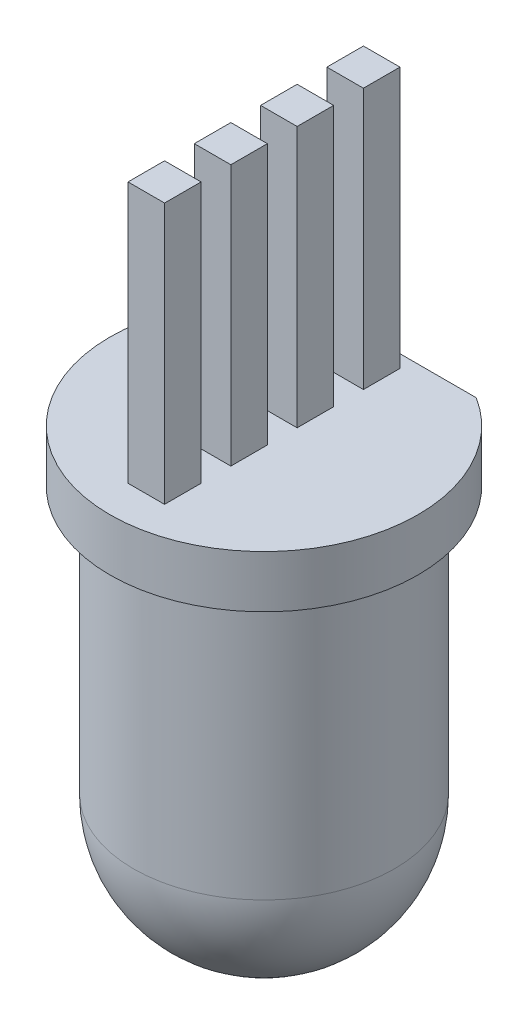
ISO-10303-21;
HEADER;
FILE_DESCRIPTION(('STEP AP214'),'2;1');
FILE_NAME('part.step','',(''),(''),'','','');
FILE_SCHEMA(('AUTOMOTIVE_DESIGN { 1 0 10303 214 1 1 1 1 }'));
ENDSEC;
DATA;
#1=APPLICATION_CONTEXT('core data for automotive mechanical design processes');
#2=APPLICATION_PROTOCOL_DEFINITION('international standard','automotive_design',2000,#1);
#3=PRODUCT_CONTEXT('',#1,'mechanical');
#4=PRODUCT('Part','Part','',(#3));
#5=PRODUCT_RELATED_PRODUCT_CATEGORY('part','',(#4));
#6=PRODUCT_DEFINITION_FORMATION('','',#4);
#7=PRODUCT_DEFINITION_CONTEXT('part definition',#1,'design');
#8=PRODUCT_DEFINITION('design','',#6,#7);
#9=PRODUCT_DEFINITION_SHAPE('','',#8);
#10=(LENGTH_UNIT() NAMED_UNIT(*) SI_UNIT(.MILLI.,.METRE.));
#11=(NAMED_UNIT(*) PLANE_ANGLE_UNIT() SI_UNIT($,.RADIAN.));
#12=(NAMED_UNIT(*) SI_UNIT($,.STERADIAN.) SOLID_ANGLE_UNIT());
#13=UNCERTAINTY_MEASURE_WITH_UNIT(LENGTH_MEASURE(1.E-05),#10,'distance_accuracy_value','');
#14=(GEOMETRIC_REPRESENTATION_CONTEXT(3) GLOBAL_UNCERTAINTY_ASSIGNED_CONTEXT((#13)) GLOBAL_UNIT_ASSIGNED_CONTEXT((#10,
#11,#12)) REPRESENTATION_CONTEXT('',''));
#15=CARTESIAN_POINT('',(0.,0.,0.));
#16=DIRECTION('',(0.,0.,1.));
#17=DIRECTION('',(1.,0.,0.));
#18=AXIS2_PLACEMENT_3D('',#15,#16,#17);
#19=CARTESIAN_POINT('',(2.95000000000001,8.6,0.));
#20=DIRECTION('',(0.,1.,0.));
#21=DIRECTION('',(-1.,0.,0.));
#22=AXIS2_PLACEMENT_3D('',#19,#20,#21);
#23=PLANE('',#22);
#24=DIRECTION('',(1.,0.,0.));
#25=VECTOR('',#24,1.);
#26=CARTESIAN_POINT('',(0.350000000000002,8.6,2.255));
#27=LINE('',#26,#25);
#28=CARTESIAN_POINT('',(-0.349999999999998,8.6,2.255));
#29=VERTEX_POINT('',#28);
#30=CARTESIAN_POINT('',(0.350000000000002,8.6,2.255));
#31=VERTEX_POINT('',#30);
#32=EDGE_CURVE('E382',#29,#31,#27,.T.);
#33=ORIENTED_EDGE('',*,*,#32,.F.);
#34=DIRECTION('',(0.,0.,1.));
#35=VECTOR('',#34,1.);
#36=CARTESIAN_POINT('',(-0.349999999999998,8.6,2.255));
#37=LINE('',#36,#35);
#38=CARTESIAN_POINT('',(-0.349999999999998,8.6,1.555));
#39=VERTEX_POINT('',#38);
#40=EDGE_CURVE('E378',#39,#29,#37,.T.);
#41=ORIENTED_EDGE('',*,*,#40,.F.);
#42=DIRECTION('',(-1.,0.,0.));
#43=VECTOR('',#42,1.);
#44=CARTESIAN_POINT('',(-0.349999999999998,8.6,1.555));
#45=LINE('',#44,#43);
#46=CARTESIAN_POINT('',(0.350000000000017,8.6,1.555));
#47=VERTEX_POINT('',#46);
#48=EDGE_CURVE('E390',#47,#39,#45,.T.);
#49=ORIENTED_EDGE('',*,*,#48,.F.);
#50=DIRECTION('',(0.,0.,-1.));
#51=VECTOR('',#50,1.);
#52=CARTESIAN_POINT('',(0.350000000000002,8.6,1.555));
#53=LINE('',#52,#51);
#54=EDGE_CURVE('E386',#31,#47,#53,.T.);
#55=ORIENTED_EDGE('',*,*,#54,.F.);
#56=EDGE_LOOP('',(#33,#41,#49,#55));
#57=FACE_BOUND('',#56,.T.);
#58=DIRECTION('',(1.,0.,0.));
#59=VECTOR('',#58,1.);
#60=CARTESIAN_POINT('',(0.350000000000002,8.6,-1.555));
#61=LINE('',#60,#59);
#62=CARTESIAN_POINT('',(-0.349999999999998,8.6,-1.555));
#63=VERTEX_POINT('',#62);
#64=CARTESIAN_POINT('',(0.350000000000002,8.6,-1.555));
#65=VERTEX_POINT('',#64);
#66=EDGE_CURVE('E437',#63,#65,#61,.T.);
#67=ORIENTED_EDGE('',*,*,#66,.F.);
#68=DIRECTION('',(0.,0.,1.));
#69=VECTOR('',#68,1.);
#70=CARTESIAN_POINT('',(-0.349999999999998,8.6,-1.555));
#71=LINE('',#70,#69);
#72=CARTESIAN_POINT('',(-0.349999999999998,8.6,-2.255));
#73=VERTEX_POINT('',#72);
#74=EDGE_CURVE('E434',#73,#63,#71,.T.);
#75=ORIENTED_EDGE('',*,*,#74,.F.);
#76=DIRECTION('',(-1.,0.,0.));
#77=VECTOR('',#76,1.);
#78=CARTESIAN_POINT('',(-0.349999999999998,8.6,-2.255));
#79=LINE('',#78,#77);
#80=CARTESIAN_POINT('',(0.350000000000016,8.6,-2.255));
#81=VERTEX_POINT('',#80);
#82=EDGE_CURVE('E192',#81,#73,#79,.T.);
#83=ORIENTED_EDGE('',*,*,#82,.F.);
#84=DIRECTION('',(0.,0.,-1.));
#85=VECTOR('',#84,1.);
#86=CARTESIAN_POINT('',(0.350000000000002,8.6,-2.255));
#87=LINE('',#86,#85);
#88=EDGE_CURVE('E201',#65,#81,#87,.T.);
#89=ORIENTED_EDGE('',*,*,#88,.F.);
#90=EDGE_LOOP('',(#67,#75,#83,#89));
#91=FACE_BOUND('',#90,.T.);
#92=DIRECTION('',(-1.,0.,0.));
#93=VECTOR('',#92,1.);
#94=CARTESIAN_POINT('',(-2.03164321843019,8.6,-2.5));
#95=LINE('',#94,#93);
#96=CARTESIAN_POINT('',(1.56604597633659,8.6,-2.5));
#97=VERTEX_POINT('',#96);
#98=CARTESIAN_POINT('',(-1.56604597633658,8.6,-2.5));
#99=VERTEX_POINT('',#98);
#100=EDGE_CURVE('E221',#97,#99,#95,.T.);
#101=ORIENTED_EDGE('',*,*,#100,.T.);
#102=CARTESIAN_POINT('',(0.,8.6,0.));
#103=DIRECTION('',(0.,-1.,0.));
#104=DIRECTION('',(1.,0.,0.));
#105=AXIS2_PLACEMENT_3D('',#102,#103,#104);
#106=CIRCLE('',#105,2.95);
#107=EDGE_CURVE('E51',#97,#99,#106,.T.);
#108=ORIENTED_EDGE('',*,*,#107,.F.);
#109=EDGE_LOOP('',(#101,#108));
#110=FACE_BOUND('',#109,.T.);
#111=DIRECTION('',(1.,0.,0.));
#112=VECTOR('',#111,1.);
#113=CARTESIAN_POINT('',(-0.349999999999994,8.6,0.985));
#114=LINE('',#113,#112);
#115=CARTESIAN_POINT('',(-0.349999999999994,8.6,0.985));
#116=VERTEX_POINT('',#115);
#117=CARTESIAN_POINT('',(0.350000000000005,8.6,0.985));
#118=VERTEX_POINT('',#117);
#119=EDGE_CURVE('E410',#116,#118,#114,.T.);
#120=ORIENTED_EDGE('',*,*,#119,.F.);
#121=DIRECTION('',(0.,0.,1.));
#122=VECTOR('',#121,1.);
#123=CARTESIAN_POINT('',(-0.349999999999995,8.6,0.285000000000001));
#124=LINE('',#123,#122);
#125=CARTESIAN_POINT('',(-0.349999999999995,8.6,0.285000000000001));
#126=VERTEX_POINT('',#125);
#127=EDGE_CURVE('E406',#126,#116,#124,.T.);
#128=ORIENTED_EDGE('',*,*,#127,.F.);
#129=DIRECTION('',(-1.,0.,0.));
#130=VECTOR('',#129,1.);
#131=CARTESIAN_POINT('',(0.350000000000005,8.6,0.285000000000001));
#132=LINE('',#131,#130);
#133=CARTESIAN_POINT('',(0.35000000000002,8.6,0.285000000000001));
#134=VERTEX_POINT('',#133);
#135=EDGE_CURVE('E418',#134,#126,#132,.T.);
#136=ORIENTED_EDGE('',*,*,#135,.F.);
#137=DIRECTION('',(0.,0.,-1.));
#138=VECTOR('',#137,1.);
#139=CARTESIAN_POINT('',(0.350000000000005,8.6,0.985));
#140=LINE('',#139,#138);
#141=EDGE_CURVE('E414',#118,#134,#140,.T.);
#142=ORIENTED_EDGE('',*,*,#141,.F.);
#143=EDGE_LOOP('',(#120,#128,#136,#142));
#144=FACE_BOUND('',#143,.T.);
#145=DIRECTION('',(1.,0.,0.));
#146=VECTOR('',#145,1.);
#147=CARTESIAN_POINT('',(0.350000000000003,8.6,-0.285000000000001));
#148=LINE('',#147,#146);
#149=CARTESIAN_POINT('',(-0.349999999999998,8.6,-0.285));
#150=VERTEX_POINT('',#149);
#151=CARTESIAN_POINT('',(0.350000000000003,8.6,-0.285000000000001));
#152=VERTEX_POINT('',#151);
#153=EDGE_CURVE('E452',#150,#152,#148,.T.);
#154=ORIENTED_EDGE('',*,*,#153,.F.);
#155=DIRECTION('',(0.,0.,1.));
#156=VECTOR('',#155,1.);
#157=CARTESIAN_POINT('',(-0.349999999999998,8.6,-0.285));
#158=LINE('',#157,#156);
#159=CARTESIAN_POINT('',(-0.349999999999998,8.6,-0.985));
#160=VERTEX_POINT('',#159);
#161=EDGE_CURVE('E447',#160,#150,#158,.T.);
#162=ORIENTED_EDGE('',*,*,#161,.F.);
#163=DIRECTION('',(-1.,0.,0.));
#164=VECTOR('',#163,1.);
#165=CARTESIAN_POINT('',(-0.349999999999998,8.6,-0.985));
#166=LINE('',#165,#164);
#167=CARTESIAN_POINT('',(0.350000000000017,8.6,-0.985));
#168=VERTEX_POINT('',#167);
#169=EDGE_CURVE('E372',#168,#160,#166,.T.);
#170=ORIENTED_EDGE('',*,*,#169,.F.);
#171=DIRECTION('',(0.,0.,-1.));
#172=VECTOR('',#171,1.);
#173=CARTESIAN_POINT('',(0.350000000000002,8.6,-0.985));
#174=LINE('',#173,#172);
#175=EDGE_CURVE('E363',#152,#168,#174,.T.);
#176=ORIENTED_EDGE('',*,*,#175,.F.);
#177=EDGE_LOOP('',(#154,#162,#170,#176));
#178=FACE_BOUND('',#177,.T.);
#179=ADVANCED_FACE('F42',(#57,#91,#110,#144,#178),#23,.T.);
#180=CARTESIAN_POINT('',(0.,2.5,0.));
#181=DIRECTION('',(0.,-1.,0.));
#182=DIRECTION('',(-1.,0.,0.));
#183=AXIS2_PLACEMENT_3D('',#180,#181,#182);
#184=SPHERICAL_SURFACE('',#183,2.5);
#185=CARTESIAN_POINT('',(0.,2.5,0.));
#186=DIRECTION('',(0.,-1.,0.));
#187=DIRECTION('',(1.,0.,0.));
#188=AXIS2_PLACEMENT_3D('',#185,#186,#187);
#189=CIRCLE('',#188,2.50000000000001);
#190=CARTESIAN_POINT('',(2.50000000000001,2.5,0.));
#191=VERTEX_POINT('',#190);
#192=EDGE_CURVE('E225',#191,#191,#189,.T.);
#193=ORIENTED_EDGE('',*,*,#192,.T.);
#194=EDGE_LOOP('',(#193));
#195=FACE_BOUND('',#194,.T.);
#196=ADVANCED_FACE('F44',(#195),#184,.T.);
#197=CARTESIAN_POINT('',(0.,0.,0.));
#198=DIRECTION('',(0.,-1.,0.));
#199=DIRECTION('',(1.,0.,0.));
#200=AXIS2_PLACEMENT_3D('',#197,#198,#199);
#201=CYLINDRICAL_SURFACE('',#200,2.95);
#202=DIRECTION('',(0.,-1.,0.));
#203=VECTOR('',#202,1.);
#204=CARTESIAN_POINT('',(-1.56604597633658,0.,-2.5));
#205=LINE('',#204,#203);
#206=CARTESIAN_POINT('',(-1.56604597633658,7.6,-2.5));
#207=VERTEX_POINT('',#206);
#208=EDGE_CURVE('E213',#99,#207,#205,.T.);
#209=ORIENTED_EDGE('',*,*,#208,.T.);
#210=CARTESIAN_POINT('',(0.,7.6,0.));
#211=DIRECTION('',(0.,-1.,0.));
#212=DIRECTION('',(1.,0.,0.));
#213=AXIS2_PLACEMENT_3D('',#210,#211,#212);
#214=CIRCLE('',#213,2.95);
#215=CARTESIAN_POINT('',(1.56604597633659,7.6,-2.5));
#216=VERTEX_POINT('',#215);
#217=EDGE_CURVE('E233',#216,#207,#214,.T.);
#218=ORIENTED_EDGE('',*,*,#217,.F.);
#219=DIRECTION('',(0.,-1.,0.));
#220=VECTOR('',#219,1.);
#221=CARTESIAN_POINT('',(1.56604597633658,0.,-2.5));
#222=LINE('',#221,#220);
#223=EDGE_CURVE('E209',#216,#97,#222,.F.);
#224=ORIENTED_EDGE('',*,*,#223,.T.);
#225=ORIENTED_EDGE('',*,*,#107,.T.);
#226=EDGE_LOOP('',(#209,#218,#224,#225));
#227=FACE_BOUND('',#226,.T.);
#228=ADVANCED_FACE('F240',(#227),#201,.T.);
#229=CARTESIAN_POINT('',(2.50000000000001,7.6,0.));
#230=DIRECTION('',(0.,-1.,0.));
#231=DIRECTION('',(1.,0.,0.));
#232=AXIS2_PLACEMENT_3D('',#229,#230,#231);
#233=PLANE('',#232);
#234=DIRECTION('',(-1.,0.,0.));
#235=VECTOR('',#234,1.);
#236=CARTESIAN_POINT('',(-2.03164321843019,7.6,-2.5));
#237=LINE('',#236,#235);
#238=CARTESIAN_POINT('',(0.,7.6,-2.5));
#239=VERTEX_POINT('',#238);
#240=EDGE_CURVE('E218',#216,#239,#237,.T.);
#241=ORIENTED_EDGE('',*,*,#240,.F.);
#242=ORIENTED_EDGE('',*,*,#217,.T.);
#243=EDGE_CURVE('E217',#239,#207,#237,.T.);
#244=ORIENTED_EDGE('',*,*,#243,.F.);
#245=CARTESIAN_POINT('',(0.,7.6,0.));
#246=DIRECTION('',(0.,-1.,0.));
#247=DIRECTION('',(1.,0.,0.));
#248=AXIS2_PLACEMENT_3D('',#245,#246,#247);
#249=CIRCLE('',#248,2.5);
#250=EDGE_CURVE('E229',#239,#239,#249,.T.);
#251=ORIENTED_EDGE('',*,*,#250,.F.);
#252=EDGE_LOOP('',(#241,#242,#244,#251));
#253=FACE_BOUND('',#252,.T.);
#254=ADVANCED_FACE('F251',(#253),#233,.T.);
#255=CARTESIAN_POINT('',(0.,0.,0.));
#256=DIRECTION('',(0.,-1.,0.));
#257=DIRECTION('',(1.,0.,0.));
#258=AXIS2_PLACEMENT_3D('',#255,#256,#257);
#259=CYLINDRICAL_SURFACE('',#258,2.5);
#260=ORIENTED_EDGE('',*,*,#250,.T.);
#261=EDGE_LOOP('',(#260));
#262=FACE_BOUND('',#261,.T.);
#263=ORIENTED_EDGE('',*,*,#192,.F.);
#264=EDGE_LOOP('',(#263));
#265=FACE_BOUND('',#264,.T.);
#266=ADVANCED_FACE('F253',(#262,#265),#259,.T.);
#267=CARTESIAN_POINT('',(-2.03164321843019,8.601,-2.5));
#268=DIRECTION('',(0.,0.,1.));
#269=DIRECTION('',(1.,0.,0.));
#270=AXIS2_PLACEMENT_3D('',#267,#268,#269);
#271=PLANE('',#270);
#272=ORIENTED_EDGE('',*,*,#100,.F.);
#273=ORIENTED_EDGE('',*,*,#223,.F.);
#274=ORIENTED_EDGE('',*,*,#240,.T.);
#275=ORIENTED_EDGE('',*,*,#243,.T.);
#276=ORIENTED_EDGE('',*,*,#208,.F.);
#277=EDGE_LOOP('',(#272,#273,#274,#275,#276));
#278=FACE_BOUND('',#277,.T.);
#279=ADVANCED_FACE('F245',(#278),#271,.F.);
#280=CARTESIAN_POINT('',(-0.349999999999984,33.1,-1.555));
#281=DIRECTION('',(1.,0.,0.));
#282=DIRECTION('',(0.,1.,0.));
#283=AXIS2_PLACEMENT_3D('',#280,#281,#282);
#284=PLANE('',#283);
#285=DIRECTION('',(0.,-1.,0.));
#286=VECTOR('',#285,1.);
#287=CARTESIAN_POINT('',(-0.349999999999984,33.1,-1.555));
#288=LINE('',#287,#286);
#289=CARTESIAN_POINT('',(-0.349999999999995,13.6,-1.555));
#290=VERTEX_POINT('',#289);
#291=EDGE_CURVE('E185',#290,#63,#288,.T.);
#292=ORIENTED_EDGE('',*,*,#291,.F.);
#293=DIRECTION('',(0.,0.,1.));
#294=VECTOR('',#293,1.);
#295=CARTESIAN_POINT('',(-0.349999999999995,13.6,2.255));
#296=LINE('',#295,#294);
#297=CARTESIAN_POINT('',(-0.349999999999995,13.6,-2.255));
#298=VERTEX_POINT('',#297);
#299=EDGE_CURVE('E171',#298,#290,#296,.T.);
#300=ORIENTED_EDGE('',*,*,#299,.F.);
#301=DIRECTION('',(0.,-1.,0.));
#302=VECTOR('',#301,1.);
#303=CARTESIAN_POINT('',(-0.349999999999984,33.1,-2.255));
#304=LINE('',#303,#302);
#305=EDGE_CURVE('E183',#298,#73,#304,.T.);
#306=ORIENTED_EDGE('',*,*,#305,.T.);
#307=ORIENTED_EDGE('',*,*,#74,.T.);
#308=EDGE_LOOP('',(#292,#300,#306,#307));
#309=FACE_BOUND('',#308,.T.);
#310=ADVANCED_FACE('F181',(#309),#284,.F.);
#311=CARTESIAN_POINT('',(0.350000000000016,33.1,-1.555));
#312=DIRECTION('',(0.,0.,-1.));
#313=DIRECTION('',(-1.,0.,0.));
#314=AXIS2_PLACEMENT_3D('',#311,#312,#313);
#315=PLANE('',#314);
#316=DIRECTION('',(0.,-1.,0.));
#317=VECTOR('',#316,1.);
#318=CARTESIAN_POINT('',(0.350000000000016,33.1,-1.555));
#319=LINE('',#318,#317);
#320=CARTESIAN_POINT('',(0.350000000000005,13.6,-1.555));
#321=VERTEX_POINT('',#320);
#322=EDGE_CURVE('E199',#321,#65,#319,.T.);
#323=ORIENTED_EDGE('',*,*,#322,.F.);
#324=DIRECTION('',(-1.,0.,0.));
#325=VECTOR('',#324,1.);
#326=CARTESIAN_POINT('',(0.350000000000005,13.6,-1.555));
#327=LINE('',#326,#325);
#328=EDGE_CURVE('E445',#321,#290,#327,.T.);
#329=ORIENTED_EDGE('',*,*,#328,.T.);
#330=ORIENTED_EDGE('',*,*,#291,.T.);
#331=ORIENTED_EDGE('',*,*,#66,.T.);
#332=EDGE_LOOP('',(#323,#329,#330,#331));
#333=FACE_BOUND('',#332,.T.);
#334=ADVANCED_FACE('F277',(#333),#315,.F.);
#335=CARTESIAN_POINT('',(0.350000000000016,33.1,-2.255));
#336=DIRECTION('',(-1.,0.,0.));
#337=DIRECTION('',(0.,-1.,0.));
#338=AXIS2_PLACEMENT_3D('',#335,#336,#337);
#339=PLANE('',#338);
#340=DIRECTION('',(0.,-1.,0.));
#341=VECTOR('',#340,1.);
#342=CARTESIAN_POINT('',(0.350000000000016,33.1,-2.255));
#343=LINE('',#342,#341);
#344=CARTESIAN_POINT('',(0.350000000000005,13.6,-2.255));
#345=VERTEX_POINT('',#344);
#346=EDGE_CURVE('E195',#345,#81,#343,.T.);
#347=ORIENTED_EDGE('',*,*,#346,.F.);
#348=DIRECTION('',(0.,0.,1.));
#349=VECTOR('',#348,1.);
#350=CARTESIAN_POINT('',(0.350000000000005,13.6,-2.255));
#351=LINE('',#350,#349);
#352=EDGE_CURVE('E58',#345,#321,#351,.T.);
#353=ORIENTED_EDGE('',*,*,#352,.T.);
#354=ORIENTED_EDGE('',*,*,#322,.T.);
#355=ORIENTED_EDGE('',*,*,#88,.T.);
#356=EDGE_LOOP('',(#347,#353,#354,#355));
#357=FACE_BOUND('',#356,.T.);
#358=ADVANCED_FACE('F280',(#357),#339,.F.);
#359=CARTESIAN_POINT('',(-0.349999999999984,33.1,-2.255));
#360=DIRECTION('',(0.,0.,1.));
#361=DIRECTION('',(1.,0.,0.));
#362=AXIS2_PLACEMENT_3D('',#359,#360,#361);
#363=PLANE('',#362);
#364=ORIENTED_EDGE('',*,*,#305,.F.);
#365=DIRECTION('',(-1.,0.,0.));
#366=VECTOR('',#365,1.);
#367=CARTESIAN_POINT('',(2.95000000000002,13.6,-2.255));
#368=LINE('',#367,#366);
#369=EDGE_CURVE('E168',#345,#298,#368,.T.);
#370=ORIENTED_EDGE('',*,*,#369,.F.);
#371=ORIENTED_EDGE('',*,*,#346,.T.);
#372=ORIENTED_EDGE('',*,*,#82,.T.);
#373=EDGE_LOOP('',(#364,#370,#371,#372));
#374=FACE_BOUND('',#373,.T.);
#375=ADVANCED_FACE('F190',(#374),#363,.F.);
#376=CARTESIAN_POINT('',(-0.34999999999998,33.1,0.285000000000001));
#377=DIRECTION('',(1.,0.,0.));
#378=DIRECTION('',(0.,1.,0.));
#379=AXIS2_PLACEMENT_3D('',#376,#377,#378);
#380=PLANE('',#379);
#381=DIRECTION('',(0.,-1.,0.));
#382=VECTOR('',#381,1.);
#383=CARTESIAN_POINT('',(-0.34999999999998,33.1,0.985));
#384=LINE('',#383,#382);
#385=CARTESIAN_POINT('',(-0.349999999999995,13.6,0.985));
#386=VERTEX_POINT('',#385);
#387=EDGE_CURVE('E431',#386,#116,#384,.T.);
#388=ORIENTED_EDGE('',*,*,#387,.F.);
#389=CARTESIAN_POINT('',(-0.349999999999995,13.6,0.285000000000001));
#390=VERTEX_POINT('',#389);
#391=EDGE_CURVE('E468',#390,#386,#296,.T.);
#392=ORIENTED_EDGE('',*,*,#391,.F.);
#393=DIRECTION('',(0.,-1.,0.));
#394=VECTOR('',#393,1.);
#395=CARTESIAN_POINT('',(-0.34999999999998,33.1,0.285000000000001));
#396=LINE('',#395,#394);
#397=EDGE_CURVE('E422',#390,#126,#396,.T.);
#398=ORIENTED_EDGE('',*,*,#397,.T.);
#399=ORIENTED_EDGE('',*,*,#127,.T.);
#400=EDGE_LOOP('',(#388,#392,#398,#399));
#401=FACE_BOUND('',#400,.T.);
#402=ADVANCED_FACE('F287',(#401),#380,.F.);
#403=CARTESIAN_POINT('',(-0.34999999999998,33.1,0.985));
#404=DIRECTION('',(0.,0.,-1.));
#405=DIRECTION('',(-1.,0.,0.));
#406=AXIS2_PLACEMENT_3D('',#403,#404,#405);
#407=PLANE('',#406);
#408=DIRECTION('',(0.,-1.,0.));
#409=VECTOR('',#408,1.);
#410=CARTESIAN_POINT('',(0.35000000000002,33.1,0.985));
#411=LINE('',#410,#409);
#412=CARTESIAN_POINT('',(0.350000000000008,13.6,0.985));
#413=VERTEX_POINT('',#412);
#414=EDGE_CURVE('E428',#413,#118,#411,.T.);
#415=ORIENTED_EDGE('',*,*,#414,.F.);
#416=DIRECTION('',(-1.,0.,0.));
#417=VECTOR('',#416,1.);
#418=CARTESIAN_POINT('',(-0.349999999999991,13.6,0.985));
#419=LINE('',#418,#417);
#420=EDGE_CURVE('E454',#413,#386,#419,.T.);
#421=ORIENTED_EDGE('',*,*,#420,.T.);
#422=ORIENTED_EDGE('',*,*,#387,.T.);
#423=ORIENTED_EDGE('',*,*,#119,.T.);
#424=EDGE_LOOP('',(#415,#421,#422,#423));
#425=FACE_BOUND('',#424,.T.);
#426=ADVANCED_FACE('F290',(#425),#407,.F.);
#427=CARTESIAN_POINT('',(0.35000000000002,33.1,0.985));
#428=DIRECTION('',(-1.,0.,0.));
#429=DIRECTION('',(0.,-1.,0.));
#430=AXIS2_PLACEMENT_3D('',#427,#428,#429);
#431=PLANE('',#430);
#432=DIRECTION('',(0.,-1.,0.));
#433=VECTOR('',#432,1.);
#434=CARTESIAN_POINT('',(0.35000000000002,33.1,0.285000000000001));
#435=LINE('',#434,#433);
#436=CARTESIAN_POINT('',(0.350000000000008,13.6,0.285000000000001));
#437=VERTEX_POINT('',#436);
#438=EDGE_CURVE('E425',#437,#134,#435,.T.);
#439=ORIENTED_EDGE('',*,*,#438,.F.);
#440=DIRECTION('',(0.,0.,1.));
#441=VECTOR('',#440,1.);
#442=CARTESIAN_POINT('',(0.350000000000008,13.6,0.985));
#443=LINE('',#442,#441);
#444=EDGE_CURVE('E66',#437,#413,#443,.T.);
#445=ORIENTED_EDGE('',*,*,#444,.T.);
#446=ORIENTED_EDGE('',*,*,#414,.T.);
#447=ORIENTED_EDGE('',*,*,#141,.T.);
#448=EDGE_LOOP('',(#439,#445,#446,#447));
#449=FACE_BOUND('',#448,.T.);
#450=ADVANCED_FACE('F294',(#449),#431,.F.);
#451=CARTESIAN_POINT('',(0.35000000000002,33.1,0.285000000000001));
#452=DIRECTION('',(0.,0.,1.));
#453=DIRECTION('',(1.,0.,0.));
#454=AXIS2_PLACEMENT_3D('',#451,#452,#453);
#455=PLANE('',#454);
#456=ORIENTED_EDGE('',*,*,#397,.F.);
#457=DIRECTION('',(1.,0.,0.));
#458=VECTOR('',#457,1.);
#459=CARTESIAN_POINT('',(0.350000000000008,13.6,0.285000000000001));
#460=LINE('',#459,#458);
#461=EDGE_CURVE('E484',#390,#437,#460,.T.);
#462=ORIENTED_EDGE('',*,*,#461,.T.);
#463=ORIENTED_EDGE('',*,*,#438,.T.);
#464=ORIENTED_EDGE('',*,*,#135,.T.);
#465=EDGE_LOOP('',(#456,#462,#463,#464));
#466=FACE_BOUND('',#465,.T.);
#467=ADVANCED_FACE('F298',(#466),#455,.F.);
#468=CARTESIAN_POINT('',(-0.349999999999983,33.1,2.255));
#469=DIRECTION('',(1.,0.,0.));
#470=DIRECTION('',(0.,1.,0.));
#471=AXIS2_PLACEMENT_3D('',#468,#469,#470);
#472=PLANE('',#471);
#473=DIRECTION('',(0.,-1.,0.));
#474=VECTOR('',#473,1.);
#475=CARTESIAN_POINT('',(-0.349999999999983,33.1,2.255));
#476=LINE('',#475,#474);
#477=CARTESIAN_POINT('',(-0.349999999999995,13.6,2.255));
#478=VERTEX_POINT('',#477);
#479=EDGE_CURVE('E403',#478,#29,#476,.T.);
#480=ORIENTED_EDGE('',*,*,#479,.F.);
#481=CARTESIAN_POINT('',(-0.349999999999995,13.6,1.555));
#482=VERTEX_POINT('',#481);
#483=EDGE_CURVE('E189',#482,#478,#296,.T.);
#484=ORIENTED_EDGE('',*,*,#483,.F.);
#485=DIRECTION('',(0.,-1.,0.));
#486=VECTOR('',#485,1.);
#487=CARTESIAN_POINT('',(-0.349999999999983,33.1,1.555));
#488=LINE('',#487,#486);
#489=EDGE_CURVE('E394',#482,#39,#488,.T.);
#490=ORIENTED_EDGE('',*,*,#489,.T.);
#491=ORIENTED_EDGE('',*,*,#40,.T.);
#492=EDGE_LOOP('',(#480,#484,#490,#491));
#493=FACE_BOUND('',#492,.T.);
#494=ADVANCED_FACE('F302',(#493),#472,.F.);
#495=CARTESIAN_POINT('',(0.350000000000017,33.1,2.255));
#496=DIRECTION('',(0.,0.,-1.));
#497=DIRECTION('',(-1.,0.,0.));
#498=AXIS2_PLACEMENT_3D('',#495,#496,#497);
#499=PLANE('',#498);
#500=DIRECTION('',(0.,-1.,0.));
#501=VECTOR('',#500,1.);
#502=CARTESIAN_POINT('',(0.350000000000017,33.1,2.255));
#503=LINE('',#502,#501);
#504=CARTESIAN_POINT('',(0.350000000000005,13.6,2.255));
#505=VERTEX_POINT('',#504);
#506=EDGE_CURVE('E400',#505,#31,#503,.T.);
#507=ORIENTED_EDGE('',*,*,#506,.F.);
#508=DIRECTION('',(-1.,0.,0.));
#509=VECTOR('',#508,1.);
#510=CARTESIAN_POINT('',(2.95000000000002,13.6,2.255));
#511=LINE('',#510,#509);
#512=EDGE_CURVE('E177',#505,#478,#511,.T.);
#513=ORIENTED_EDGE('',*,*,#512,.T.);
#514=ORIENTED_EDGE('',*,*,#479,.T.);
#515=ORIENTED_EDGE('',*,*,#32,.T.);
#516=EDGE_LOOP('',(#507,#513,#514,#515));
#517=FACE_BOUND('',#516,.T.);
#518=ADVANCED_FACE('F306',(#517),#499,.F.);
#519=CARTESIAN_POINT('',(0.350000000000017,33.1,1.555));
#520=DIRECTION('',(-1.,0.,0.));
#521=DIRECTION('',(0.,-1.,0.));
#522=AXIS2_PLACEMENT_3D('',#519,#520,#521);
#523=PLANE('',#522);
#524=DIRECTION('',(0.,-1.,0.));
#525=VECTOR('',#524,1.);
#526=CARTESIAN_POINT('',(0.350000000000017,33.1,1.555));
#527=LINE('',#526,#525);
#528=CARTESIAN_POINT('',(0.350000000000005,13.6,1.555));
#529=VERTEX_POINT('',#528);
#530=EDGE_CURVE('E397',#529,#47,#527,.T.);
#531=ORIENTED_EDGE('',*,*,#530,.F.);
#532=DIRECTION('',(0.,0.,1.));
#533=VECTOR('',#532,1.);
#534=CARTESIAN_POINT('',(0.350000000000005,13.6,1.555));
#535=LINE('',#534,#533);
#536=EDGE_CURVE('E480',#529,#505,#535,.T.);
#537=ORIENTED_EDGE('',*,*,#536,.T.);
#538=ORIENTED_EDGE('',*,*,#506,.T.);
#539=ORIENTED_EDGE('',*,*,#54,.T.);
#540=EDGE_LOOP('',(#531,#537,#538,#539));
#541=FACE_BOUND('',#540,.T.);
#542=ADVANCED_FACE('F310',(#541),#523,.F.);
#543=CARTESIAN_POINT('',(-0.349999999999983,33.1,1.555));
#544=DIRECTION('',(0.,0.,1.));
#545=DIRECTION('',(1.,0.,0.));
#546=AXIS2_PLACEMENT_3D('',#543,#544,#545);
#547=PLANE('',#546);
#548=ORIENTED_EDGE('',*,*,#489,.F.);
#549=DIRECTION('',(1.,0.,0.));
#550=VECTOR('',#549,1.);
#551=CARTESIAN_POINT('',(-0.349999999999995,13.6,1.555));
#552=LINE('',#551,#550);
#553=EDGE_CURVE('E476',#482,#529,#552,.T.);
#554=ORIENTED_EDGE('',*,*,#553,.T.);
#555=ORIENTED_EDGE('',*,*,#530,.T.);
#556=ORIENTED_EDGE('',*,*,#48,.T.);
#557=EDGE_LOOP('',(#548,#554,#555,#556));
#558=FACE_BOUND('',#557,.T.);
#559=ADVANCED_FACE('F314',(#558),#547,.F.);
#560=CARTESIAN_POINT('',(-0.349999999999983,33.1,-0.285));
#561=DIRECTION('',(1.,0.,0.));
#562=DIRECTION('',(0.,1.,0.));
#563=AXIS2_PLACEMENT_3D('',#560,#561,#562);
#564=PLANE('',#563);
#565=DIRECTION('',(0.,-1.,0.));
#566=VECTOR('',#565,1.);
#567=CARTESIAN_POINT('',(-0.349999999999983,33.1,-0.285));
#568=LINE('',#567,#566);
#569=CARTESIAN_POINT('',(-0.349999999999995,13.6,-0.285000000000001));
#570=VERTEX_POINT('',#569);
#571=EDGE_CURVE('E370',#570,#150,#568,.T.);
#572=ORIENTED_EDGE('',*,*,#571,.F.);
#573=CARTESIAN_POINT('',(-0.349999999999995,13.6,-0.985));
#574=VERTEX_POINT('',#573);
#575=EDGE_CURVE('E187',#574,#570,#296,.T.);
#576=ORIENTED_EDGE('',*,*,#575,.F.);
#577=DIRECTION('',(0.,-1.,0.));
#578=VECTOR('',#577,1.);
#579=CARTESIAN_POINT('',(-0.349999999999983,33.1,-0.985));
#580=LINE('',#579,#578);
#581=EDGE_CURVE('E361',#574,#160,#580,.T.);
#582=ORIENTED_EDGE('',*,*,#581,.T.);
#583=ORIENTED_EDGE('',*,*,#161,.T.);
#584=EDGE_LOOP('',(#572,#576,#582,#583));
#585=FACE_BOUND('',#584,.T.);
#586=ADVANCED_FACE('F318',(#585),#564,.F.);
#587=CARTESIAN_POINT('',(0.350000000000017,33.1,-0.285000000000001));
#588=DIRECTION('',(0.,0.,-1.));
#589=DIRECTION('',(-1.,0.,0.));
#590=AXIS2_PLACEMENT_3D('',#587,#588,#589);
#591=PLANE('',#590);
#592=DIRECTION('',(0.,-1.,0.));
#593=VECTOR('',#592,1.);
#594=CARTESIAN_POINT('',(0.350000000000017,33.1,-0.285000000000001));
#595=LINE('',#594,#593);
#596=CARTESIAN_POINT('',(0.350000000000006,13.6,-0.285000000000001));
#597=VERTEX_POINT('',#596);
#598=EDGE_CURVE('E366',#597,#152,#595,.T.);
#599=ORIENTED_EDGE('',*,*,#598,.F.);
#600=DIRECTION('',(-1.,0.,0.));
#601=VECTOR('',#600,1.);
#602=CARTESIAN_POINT('',(0.350000000000006,13.6,-0.285000000000001));
#603=LINE('',#602,#601);
#604=EDGE_CURVE('E352',#597,#570,#603,.T.);
#605=ORIENTED_EDGE('',*,*,#604,.T.);
#606=ORIENTED_EDGE('',*,*,#571,.T.);
#607=ORIENTED_EDGE('',*,*,#153,.T.);
#608=EDGE_LOOP('',(#599,#605,#606,#607));
#609=FACE_BOUND('',#608,.T.);
#610=ADVANCED_FACE('F322',(#609),#591,.F.);
#611=CARTESIAN_POINT('',(0.350000000000017,33.1,-0.985));
#612=DIRECTION('',(-1.,0.,0.));
#613=DIRECTION('',(0.,-1.,0.));
#614=AXIS2_PLACEMENT_3D('',#611,#612,#613);
#615=PLANE('',#614);
#616=DIRECTION('',(0.,-1.,0.));
#617=VECTOR('',#616,1.);
#618=CARTESIAN_POINT('',(0.350000000000017,33.1,-0.985));
#619=LINE('',#618,#617);
#620=CARTESIAN_POINT('',(0.350000000000005,13.6,-0.985));
#621=VERTEX_POINT('',#620);
#622=EDGE_CURVE('E359',#621,#168,#619,.T.);
#623=ORIENTED_EDGE('',*,*,#622,.F.);
#624=DIRECTION('',(0.,0.,1.));
#625=VECTOR('',#624,1.);
#626=CARTESIAN_POINT('',(0.350000000000005,13.6,-0.985));
#627=LINE('',#626,#625);
#628=EDGE_CURVE('E349',#621,#597,#627,.T.);
#629=ORIENTED_EDGE('',*,*,#628,.T.);
#630=ORIENTED_EDGE('',*,*,#598,.T.);
#631=ORIENTED_EDGE('',*,*,#175,.T.);
#632=EDGE_LOOP('',(#623,#629,#630,#631));
#633=FACE_BOUND('',#632,.T.);
#634=ADVANCED_FACE('F326',(#633),#615,.F.);
#635=CARTESIAN_POINT('',(-0.349999999999983,33.1,-0.985));
#636=DIRECTION('',(0.,0.,1.));
#637=DIRECTION('',(1.,0.,0.));
#638=AXIS2_PLACEMENT_3D('',#635,#636,#637);
#639=PLANE('',#638);
#640=ORIENTED_EDGE('',*,*,#581,.F.);
#641=DIRECTION('',(1.,0.,0.));
#642=VECTOR('',#641,1.);
#643=CARTESIAN_POINT('',(-0.349999999999995,13.6,-0.985));
#644=LINE('',#643,#642);
#645=EDGE_CURVE('E11',#574,#621,#644,.T.);
#646=ORIENTED_EDGE('',*,*,#645,.T.);
#647=ORIENTED_EDGE('',*,*,#622,.T.);
#648=ORIENTED_EDGE('',*,*,#169,.T.);
#649=EDGE_LOOP('',(#640,#646,#647,#648));
#650=FACE_BOUND('',#649,.T.);
#651=ADVANCED_FACE('F330',(#650),#639,.F.);
#652=CARTESIAN_POINT('',(2.95000000000002,13.6,2.255));
#653=DIRECTION('',(0.,-1.,0.));
#654=DIRECTION('',(1.,0.,0.));
#655=AXIS2_PLACEMENT_3D('',#652,#653,#654);
#656=PLANE('',#655);
#657=ORIENTED_EDGE('',*,*,#628,.F.);
#658=ORIENTED_EDGE('',*,*,#645,.F.);
#659=ORIENTED_EDGE('',*,*,#575,.T.);
#660=ORIENTED_EDGE('',*,*,#604,.F.);
#661=EDGE_LOOP('',(#657,#658,#659,#660));
#662=FACE_BOUND('',#661,.T.);
#663=ADVANCED_FACE('F334',(#662),#656,.F.);
#664=ORIENTED_EDGE('',*,*,#553,.F.);
#665=ORIENTED_EDGE('',*,*,#483,.T.);
#666=ORIENTED_EDGE('',*,*,#512,.F.);
#667=ORIENTED_EDGE('',*,*,#536,.F.);
#668=EDGE_LOOP('',(#664,#665,#666,#667));
#669=FACE_BOUND('',#668,.T.);
#670=ADVANCED_FACE('F341',(#669),#656,.F.);
#671=ORIENTED_EDGE('',*,*,#444,.F.);
#672=ORIENTED_EDGE('',*,*,#461,.F.);
#673=ORIENTED_EDGE('',*,*,#391,.T.);
#674=ORIENTED_EDGE('',*,*,#420,.F.);
#675=EDGE_LOOP('',(#671,#672,#673,#674));
#676=FACE_BOUND('',#675,.T.);
#677=ADVANCED_FACE('F337',(#676),#656,.F.);
#678=ORIENTED_EDGE('',*,*,#352,.F.);
#679=ORIENTED_EDGE('',*,*,#369,.T.);
#680=ORIENTED_EDGE('',*,*,#299,.T.);
#681=ORIENTED_EDGE('',*,*,#328,.F.);
#682=EDGE_LOOP('',(#678,#679,#680,#681));
#683=FACE_BOUND('',#682,.T.);
#684=ADVANCED_FACE('F170',(#683),#656,.F.);
#685=CLOSED_SHELL('',(#179,#196,#228,#254,#266,#279,#310,#334,#358,#375,#402,#426,#450,#467,
#494,#518,#542,#559,#586,#610,#634,#651,#663,#670,#677,#684));
#686=MANIFOLD_SOLID_BREP('B2',#685);
#687=ADVANCED_BREP_SHAPE_REPRESENTATION('',(#18,#686),#14);
#688=SHAPE_DEFINITION_REPRESENTATION(#9,#687);
ENDSEC;
END-ISO-10303-21;
